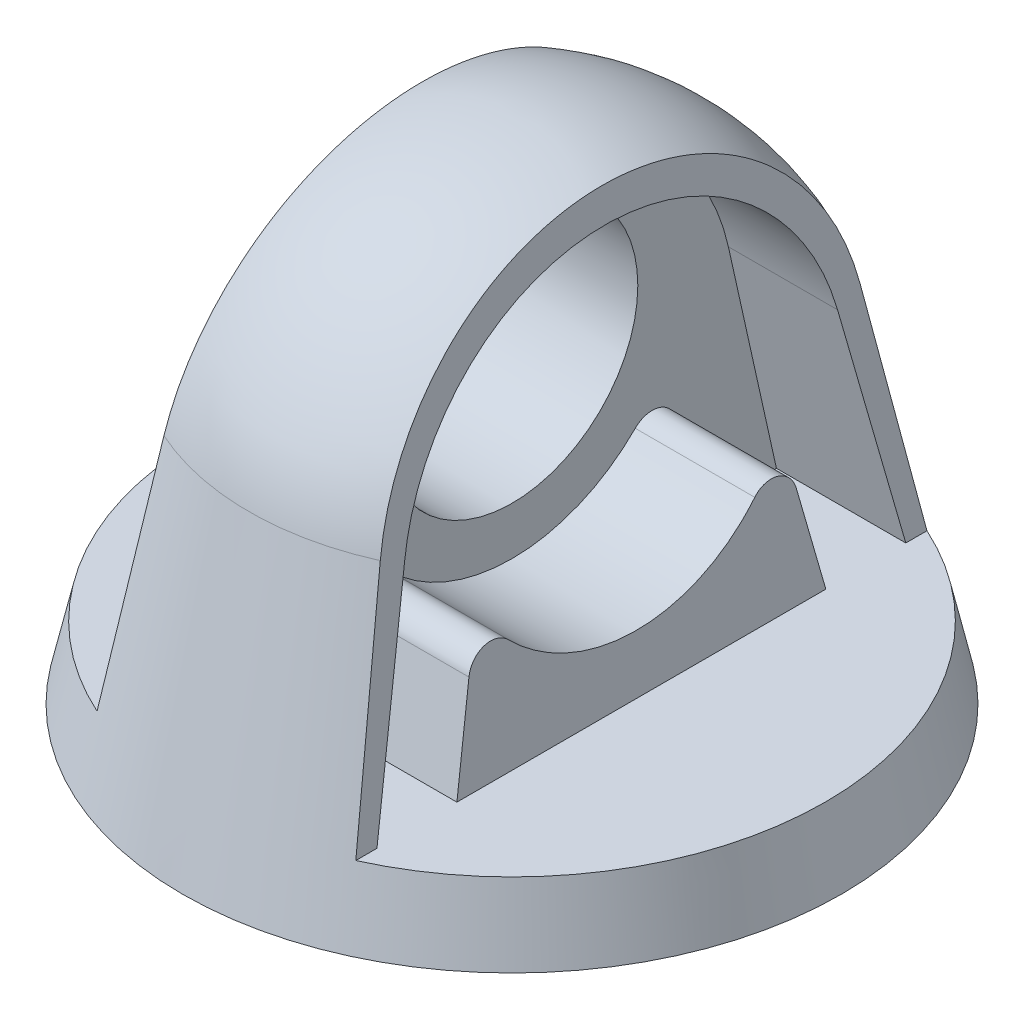
ISO-10303-21;
HEADER;
FILE_DESCRIPTION(('STEP AP214'),'2;1');
FILE_NAME('part.step','',(''),(''),'','','');
FILE_SCHEMA(('AUTOMOTIVE_DESIGN { 1 0 10303 214 1 1 1 1 }'));
ENDSEC;
DATA;
#1=APPLICATION_CONTEXT('core data for automotive mechanical design processes');
#2=APPLICATION_PROTOCOL_DEFINITION('international standard','automotive_design',2000,#1);
#3=PRODUCT_CONTEXT('',#1,'mechanical');
#4=PRODUCT('Part','Part','',(#3));
#5=PRODUCT_RELATED_PRODUCT_CATEGORY('part','',(#4));
#6=PRODUCT_DEFINITION_FORMATION('','',#4);
#7=PRODUCT_DEFINITION_CONTEXT('part definition',#1,'design');
#8=PRODUCT_DEFINITION('design','',#6,#7);
#9=PRODUCT_DEFINITION_SHAPE('','',#8);
#10=(LENGTH_UNIT() NAMED_UNIT(*) SI_UNIT(.MILLI.,.METRE.));
#11=(NAMED_UNIT(*) PLANE_ANGLE_UNIT() SI_UNIT($,.RADIAN.));
#12=(NAMED_UNIT(*) SI_UNIT($,.STERADIAN.) SOLID_ANGLE_UNIT());
#13=UNCERTAINTY_MEASURE_WITH_UNIT(LENGTH_MEASURE(1.E-05),#10,'distance_accuracy_value','');
#14=(GEOMETRIC_REPRESENTATION_CONTEXT(3) GLOBAL_UNCERTAINTY_ASSIGNED_CONTEXT((#13)) GLOBAL_UNIT_ASSIGNED_CONTEXT((#10,
#11,#12)) REPRESENTATION_CONTEXT('',''));
#15=CARTESIAN_POINT('',(0.,0.,0.));
#16=DIRECTION('',(0.,0.,1.));
#17=DIRECTION('',(1.,0.,0.));
#18=AXIS2_PLACEMENT_3D('',#15,#16,#17);
#19=CARTESIAN_POINT('',(21.5932881486711,12.,-276.496115993737));
#20=DIRECTION('',(0.995646288576863,0.0932119522546218,0.));
#21=DIRECTION('',(-0.0932119522546218,0.995646288576863,0.));
#22=AXIS2_PLACEMENT_3D('',#19,#20,#21);
#23=PLANE('',#22);
#24=CARTESIAN_POINT('',(18.971940896064,40.,0.));
#25=DIRECTION('',(0.995646288576863,0.0932119522546218,0.));
#26=DIRECTION('',(-0.0932119522546218,0.995646288576863,0.));
#27=AXIS2_PLACEMENT_3D('',#24,#25,#26);
#28=ELLIPSE('',#27,37.161791717103,37.);
#29=CARTESIAN_POINT('',(18.2196436442275,48.0356858598083,36.1168624434969));
#30=VERTEX_POINT('',#29);
#31=CARTESIAN_POINT('',(18.2196436442275,48.0356858598083,-36.1168624434969));
#32=VERTEX_POINT('',#31);
#33=EDGE_CURVE('E74',#30,#32,#28,.F.);
#34=ORIENTED_EDGE('',*,*,#33,.T.);
#35=DIRECTION('',(0.0910057646527772,-0.972080828949104,-0.216279478429154));
#36=VECTOR('',#35,1.);
#37=CARTESIAN_POINT('',(26.1667875724316,-36.8519724877858,-55.0036236322119));
#38=LINE('',#37,#36);
#39=CARTESIAN_POINT('',(21.5932881486711,12.,-44.134487223755));
#40=VERTEX_POINT('',#39);
#41=EDGE_CURVE('E12',#32,#40,#38,.T.);
#42=ORIENTED_EDGE('',*,*,#41,.T.);
#43=DIRECTION('',(0.,0.,1.));
#44=VECTOR('',#43,1.);
#45=CARTESIAN_POINT('',(21.5932881486711,12.,-276.496115993737));
#46=LINE('',#45,#44);
#47=CARTESIAN_POINT('',(21.5932881486711,12.,-47.6672822450918));
#48=VERTEX_POINT('',#47);
#49=EDGE_CURVE('E234',#48,#40,#46,.T.);
#50=ORIENTED_EDGE('',*,*,#49,.F.);
#51=CARTESIAN_POINT('',(18.0569660550566,49.7733314511182,-40.0428266893722));
#52=CARTESIAN_POINT('',(18.6463559614436,43.4777453312617,-41.3135882810776));
#53=CARTESIAN_POINT('',(19.2357459827641,37.18215798374,-42.5843437373356));
#54=CARTESIAN_POINT('',(20.414526255272,24.5909808333673,-45.1258423789565));
#55=CARTESIAN_POINT('',(21.0039165064593,18.2953910305162,-46.3965855643193));
#56=CARTESIAN_POINT('',(21.5933068725801,11.9998,-47.6673226142347));
#57=B_SPLINE_CURVE_WITH_KNOTS('',3,(#51,#52,#53,#54,#55,#56),.UNSPECIFIED.,.F.,.F.,(4,2,4),(0.,
19.3486325277537,38.6972650555043),.UNSPECIFIED.);
#58=CARTESIAN_POINT('',(18.0569847789655,49.7731314511182,-40.0428670593324));
#59=VERTEX_POINT('',#58);
#60=EDGE_CURVE('E257',#59,#48,#57,.T.);
#61=ORIENTED_EDGE('',*,*,#60,.F.);
#62=CARTESIAN_POINT('',(18.8071037938726,41.7607124949845,0.));
#63=DIRECTION('',(0.995646288576863,0.0932119522546218,0.));
#64=DIRECTION('',(-0.0932119522546218,0.995646288576863,0.));
#65=AXIS2_PLACEMENT_3D('',#62,#63,#64);
#66=CIRCLE('',#65,40.8435152551358);
#67=CARTESIAN_POINT('',(18.0569847789656,49.7731314511182,40.0428670593325));
#68=VERTEX_POINT('',#67);
#69=EDGE_CURVE('E237',#68,#59,#66,.F.);
#70=ORIENTED_EDGE('',*,*,#69,.F.);
#71=CARTESIAN_POINT('',(21.5933068725801,11.9998,47.6673226142347));
#72=CARTESIAN_POINT('',(21.0039165064593,18.2953910305162,46.3965855643193));
#73=CARTESIAN_POINT('',(20.414526255272,24.5909808333673,45.1258423789565));
#74=CARTESIAN_POINT('',(19.2357459827641,37.18215798374,42.5843437373356));
#75=CARTESIAN_POINT('',(18.6463559614436,43.4777453312617,41.3135882810776));
#76=CARTESIAN_POINT('',(18.0569660550566,49.7733314511182,40.0428266893722));
#77=B_SPLINE_CURVE_WITH_KNOTS('',3,(#71,#72,#73,#74,#75,#76),.UNSPECIFIED.,.F.,.F.,(4,2,4),(0.,
19.3486325277505,38.6972650555043),.UNSPECIFIED.);
#78=CARTESIAN_POINT('',(21.5932881486711,12.,47.6672822450918));
#79=VERTEX_POINT('',#78);
#80=EDGE_CURVE('E249',#79,#68,#77,.T.);
#81=ORIENTED_EDGE('',*,*,#80,.F.);
#82=CARTESIAN_POINT('',(21.5932881486711,12.,44.134487223755));
#83=VERTEX_POINT('',#82);
#84=EDGE_CURVE('E239',#83,#79,#46,.T.);
#85=ORIENTED_EDGE('',*,*,#84,.F.);
#86=DIRECTION('',(-0.0910057646527772,0.972080828949104,-0.216279478429154));
#87=VECTOR('',#86,1.);
#88=CARTESIAN_POINT('',(15.2824188075597,79.4097418323252,29.1364095224381));
#89=LINE('',#88,#87);
#90=EDGE_CURVE('E297',#83,#30,#89,.T.);
#91=ORIENTED_EDGE('',*,*,#90,.T.);
#92=EDGE_LOOP('',(#34,#42,#50,#61,#70,#81,#85,#91));
#93=FACE_BOUND('',#92,.T.);
#94=ADVANCED_FACE('F66',(#93),#23,.T.);
#95=CARTESIAN_POINT('',(-36.,50.,0.));
#96=DIRECTION('',(1.,0.,0.));
#97=DIRECTION('',(0.,0.,-1.));
#98=AXIS2_PLACEMENT_3D('',#95,#96,#97);
#99=CYLINDRICAL_SURFACE('',#98,21.);
#100=CARTESIAN_POINT('',(-18.0357454487043,50.,0.));
#101=DIRECTION('',(0.995646288576863,-0.0932119522546218,0.));
#102=DIRECTION('',(0.0932119522546218,0.995646288576863,0.));
#103=AXIS2_PLACEMENT_3D('',#100,#101,#102);
#104=ELLIPSE('',#103,21.0918277313287,21.);
#105=CARTESIAN_POINT('',(-16.069735009249,71.,0.));
#106=VERTEX_POINT('',#105);
#107=EDGE_CURVE('E192',#106,#106,#104,.F.);
#108=ORIENTED_EDGE('',*,*,#107,.T.);
#109=EDGE_LOOP('',(#108));
#110=FACE_BOUND('',#109,.T.);
#111=CARTESIAN_POINT('',(0.,50.,0.));
#112=DIRECTION('',(1.,0.,0.));
#113=DIRECTION('',(0.,0.,-1.));
#114=AXIS2_PLACEMENT_3D('',#111,#112,#113);
#115=CIRCLE('',#114,21.);
#116=CARTESIAN_POINT('',(0.,50.,-21.));
#117=VERTEX_POINT('',#116);
#118=EDGE_CURVE('E175',#117,#117,#115,.F.);
#119=ORIENTED_EDGE('',*,*,#118,.F.);
#120=EDGE_LOOP('',(#119));
#121=FACE_BOUND('',#120,.T.);
#122=ADVANCED_FACE('F287',(#110,#121),#99,.F.);
#123=CARTESIAN_POINT('',(0.,40.,0.));
#124=DIRECTION('',(0.,1.,0.));
#125=DIRECTION('',(1.,0.,0.));
#126=AXIS2_PLACEMENT_3D('',#123,#124,#125);
#127=SPHERICAL_SURFACE('',#126,45.);
#128=CARTESIAN_POINT('',(-18.8071037938726,41.7607124949845,0.));
#129=DIRECTION('',(0.995646288576863,-0.0932119522546218,0.));
#130=DIRECTION('',(0.0932119522546218,0.995646288576863,0.));
#131=AXIS2_PLACEMENT_3D('',#128,#129,#130);
#132=CIRCLE('',#131,40.8435152551358);
#133=CARTESIAN_POINT('',(-18.0569847789656,49.7731314511182,40.0428670593325));
#134=VERTEX_POINT('',#133);
#135=CARTESIAN_POINT('',(-18.0569847789656,49.7731314511182,-40.0428670593325));
#136=VERTEX_POINT('',#135);
#137=EDGE_CURVE('E335',#134,#136,#132,.F.);
#138=ORIENTED_EDGE('',*,*,#137,.F.);
#139=CARTESIAN_POINT('',(0.,49.7731314511182,0.));
#140=DIRECTION('',(0.,1.,0.));
#141=DIRECTION('',(0.,0.,1.));
#142=AXIS2_PLACEMENT_3D('',#139,#140,#141);
#143=CIRCLE('',#142,43.9259137826314);
#144=EDGE_CURVE('E244',#134,#68,#143,.T.);
#145=ORIENTED_EDGE('',*,*,#144,.T.);
#146=ORIENTED_EDGE('',*,*,#69,.T.);
#147=EDGE_CURVE('E246',#59,#136,#143,.T.);
#148=ORIENTED_EDGE('',*,*,#147,.T.);
#149=EDGE_LOOP('',(#138,#145,#146,#148));
#150=FACE_BOUND('',#149,.T.);
#151=ADVANCED_FACE('F68',(#150),#127,.T.);
#152=CARTESIAN_POINT('',(0.,49.7731314511182,0.));
#153=DIRECTION('',(0.,-1.,0.));
#154=DIRECTION('',(0.,0.,-1.));
#155=AXIS2_PLACEMENT_3D('',#152,#153,#154);
#156=CONICAL_SURFACE('',#155,43.9259137826314,0.218925298612067);
#157=CARTESIAN_POINT('',(-18.0569660550566,49.7733314511182,-40.0428266893722));
#158=CARTESIAN_POINT('',(-18.6463559614436,43.4777453312617,-41.3135882810776));
#159=CARTESIAN_POINT('',(-19.2357459827641,37.18215798374,-42.5843437373356));
#160=CARTESIAN_POINT('',(-20.414526255272,24.5909808333673,-45.1258423789565));
#161=CARTESIAN_POINT('',(-21.0039165064593,18.2953910305162,-46.3965855643193));
#162=CARTESIAN_POINT('',(-21.5933068725801,11.9998,-47.6673226142347));
#163=B_SPLINE_CURVE_WITH_KNOTS('',3,(#157,#158,#159,#160,#161,#162),.UNSPECIFIED.,.F.,.F.,(4,2,
4),(0.,19.3486325277537,38.6972650555043),.UNSPECIFIED.);
#164=CARTESIAN_POINT('',(-21.5932881486711,12.,-47.6672822450918));
#165=VERTEX_POINT('',#164);
#166=EDGE_CURVE('E195',#136,#165,#163,.T.);
#167=ORIENTED_EDGE('',*,*,#166,.F.);
#168=ORIENTED_EDGE('',*,*,#147,.F.);
#169=ORIENTED_EDGE('',*,*,#60,.T.);
#170=CARTESIAN_POINT('',(0.,12.,0.));
#171=DIRECTION('',(0.,1.,0.));
#172=DIRECTION('',(-1.,0.,0.));
#173=AXIS2_PLACEMENT_3D('',#170,#171,#172);
#174=CIRCLE('',#173,52.3301050037623);
#175=EDGE_CURVE('E247',#48,#79,#174,.F.);
#176=ORIENTED_EDGE('',*,*,#175,.T.);
#177=ORIENTED_EDGE('',*,*,#80,.T.);
#178=ORIENTED_EDGE('',*,*,#144,.F.);
#179=CARTESIAN_POINT('',(-21.5933068725801,11.9998,47.6673226142347));
#180=CARTESIAN_POINT('',(-21.0039165064593,18.2953910305162,46.3965855643193));
#181=CARTESIAN_POINT('',(-20.414526255272,24.5909808333673,45.1258423789565));
#182=CARTESIAN_POINT('',(-19.2357459827641,37.18215798374,42.5843437373356));
#183=CARTESIAN_POINT('',(-18.6463559614436,43.4777453312617,41.3135882810776));
#184=CARTESIAN_POINT('',(-18.0569660550566,49.7733314511182,40.0428266893722));
#185=B_SPLINE_CURVE_WITH_KNOTS('',3,(#179,#180,#181,#182,#183,#184),.UNSPECIFIED.,.F.,.F.,(4,2,
4),(0.,19.3486325277505,38.6972650555043),.UNSPECIFIED.);
#186=CARTESIAN_POINT('',(-21.5932881486711,12.,47.6672822450918));
#187=VERTEX_POINT('',#186);
#188=EDGE_CURVE('E328',#187,#134,#185,.T.);
#189=ORIENTED_EDGE('',*,*,#188,.F.);
#190=CARTESIAN_POINT('',(0.,12.,0.));
#191=DIRECTION('',(0.,1.,0.));
#192=DIRECTION('',(-1.,0.,0.));
#193=AXIS2_PLACEMENT_3D('',#190,#191,#192);
#194=CIRCLE('',#193,52.3301050037623);
#195=EDGE_CURVE('E81',#187,#165,#194,.F.);
#196=ORIENTED_EDGE('',*,*,#195,.T.);
#197=EDGE_LOOP('',(#167,#168,#169,#176,#177,#178,#189,#196));
#198=FACE_BOUND('',#197,.T.);
#199=CARTESIAN_POINT('',(0.,0.,0.));
#200=DIRECTION('',(0.,1.,0.));
#201=DIRECTION('',(0.,0.,1.));
#202=AXIS2_PLACEMENT_3D('',#199,#200,#201);
#203=CIRCLE('',#202,55.);
#204=CARTESIAN_POINT('',(0.,0.,55.));
#205=VERTEX_POINT('',#204);
#206=EDGE_CURVE('E241',#205,#205,#203,.T.);
#207=ORIENTED_EDGE('',*,*,#206,.T.);
#208=EDGE_LOOP('',(#207));
#209=FACE_BOUND('',#208,.T.);
#210=ADVANCED_FACE('F263',(#198,#209),#156,.T.);
#211=CARTESIAN_POINT('',(0.,0.,0.));
#212=DIRECTION('',(0.,-1.,0.));
#213=DIRECTION('',(0.,0.,-1.));
#214=AXIS2_PLACEMENT_3D('',#211,#212,#213);
#215=PLANE('',#214);
#216=ORIENTED_EDGE('',*,*,#206,.F.);
#217=EDGE_LOOP('',(#216));
#218=FACE_BOUND('',#217,.T.);
#219=ADVANCED_FACE('F277',(#218),#215,.T.);
#220=CARTESIAN_POINT('',(52.3301050037623,12.,-276.496115993737));
#221=DIRECTION('',(0.,1.,0.));
#222=DIRECTION('',(-1.,0.,0.));
#223=AXIS2_PLACEMENT_3D('',#220,#221,#222);
#224=PLANE('',#223);
#225=ORIENTED_EDGE('',*,*,#84,.T.);
#226=ORIENTED_EDGE('',*,*,#175,.F.);
#227=ORIENTED_EDGE('',*,*,#49,.T.);
#228=DIRECTION('',(-1.,0.,0.));
#229=VECTOR('',#228,1.);
#230=CARTESIAN_POINT('',(55.,12.,-44.134487223755));
#231=LINE('',#230,#229);
#232=CARTESIAN_POINT('',(0.,12.,-44.134487223755));
#233=VERTEX_POINT('',#232);
#234=EDGE_CURVE('E227',#40,#233,#231,.T.);
#235=ORIENTED_EDGE('',*,*,#234,.T.);
#236=DIRECTION('',(0.,0.,1.));
#237=VECTOR('',#236,1.);
#238=CARTESIAN_POINT('',(0.,12.,0.));
#239=LINE('',#238,#237);
#240=CARTESIAN_POINT('',(0.,12.,-30.7897926323778));
#241=VERTEX_POINT('',#240);
#242=EDGE_CURVE('E203',#233,#241,#239,.T.);
#243=ORIENTED_EDGE('',*,*,#242,.T.);
#244=DIRECTION('',(-1.,0.,0.));
#245=VECTOR('',#244,1.);
#246=CARTESIAN_POINT('',(55.,12.,-30.7897926323778));
#247=LINE('',#246,#245);
#248=CARTESIAN_POINT('',(21.5932881486711,12.,-30.7897926323778));
#249=VERTEX_POINT('',#248);
#250=EDGE_CURVE('E229',#249,#241,#247,.T.);
#251=ORIENTED_EDGE('',*,*,#250,.F.);
#252=CARTESIAN_POINT('',(21.5932881486711,12.,30.7897926323778));
#253=VERTEX_POINT('',#252);
#254=EDGE_CURVE('E238',#249,#253,#46,.T.);
#255=ORIENTED_EDGE('',*,*,#254,.T.);
#256=DIRECTION('',(-1.,0.,0.));
#257=VECTOR('',#256,1.);
#258=CARTESIAN_POINT('',(55.,12.,30.7897926323778));
#259=LINE('',#258,#257);
#260=CARTESIAN_POINT('',(0.,12.,30.7897926323778));
#261=VERTEX_POINT('',#260);
#262=EDGE_CURVE('E219',#253,#261,#259,.T.);
#263=ORIENTED_EDGE('',*,*,#262,.T.);
#264=CARTESIAN_POINT('',(0.,12.,44.134487223755));
#265=VERTEX_POINT('',#264);
#266=EDGE_CURVE('E207',#261,#265,#239,.T.);
#267=ORIENTED_EDGE('',*,*,#266,.T.);
#268=DIRECTION('',(-1.,0.,0.));
#269=VECTOR('',#268,1.);
#270=CARTESIAN_POINT('',(55.,12.,44.134487223755));
#271=LINE('',#270,#269);
#272=EDGE_CURVE('E221',#83,#265,#271,.T.);
#273=ORIENTED_EDGE('',*,*,#272,.F.);
#274=EDGE_LOOP('',(#225,#226,#227,#235,#243,#251,#255,#263,#267,#273));
#275=FACE_BOUND('',#274,.T.);
#276=ADVANCED_FACE('F272',(#275),#224,.T.);
#277=ORIENTED_EDGE('',*,*,#254,.F.);
#278=DIRECTION('',(-0.0910057646527772,0.972080828949104,0.216279478429154));
#279=VECTOR('',#278,1.);
#280=CARTESIAN_POINT('',(26.4294469166056,-39.6575762205829,-42.2831513214698));
#281=LINE('',#280,#279);
#282=CARTESIAN_POINT('',(20.1317254296663,27.6117264095524,-27.3163201137531));
#283=VERTEX_POINT('',#282);
#284=EDGE_CURVE('E301',#249,#283,#281,.T.);
#285=ORIENTED_EDGE('',*,*,#284,.T.);
#286=CARTESIAN_POINT('',(20.2130548622973,26.7430036138975,-23.4117944441859));
#287=DIRECTION('',(0.995646288576863,0.0932119522546218,0.));
#288=DIRECTION('',(-0.0932119522546218,0.995646288576863,0.));
#289=AXIS2_PLACEMENT_3D('',#286,#287,#288);
#290=ELLIPSE('',#289,4.01749099644357,4.);
#291=CARTESIAN_POINT('',(19.9491385697406,29.5620334788796,-20.574001178224));
#292=VERTEX_POINT('',#291);
#293=EDGE_CURVE('E306',#292,#283,#290,.F.);
#294=ORIENTED_EDGE('',*,*,#293,.F.);
#295=CARTESIAN_POINT('',(18.0357454487043,50.,0.));
#296=DIRECTION('',(0.995646288576863,0.0932119522546218,0.));
#297=DIRECTION('',(-0.0932119522546218,0.995646288576863,0.));
#298=AXIS2_PLACEMENT_3D('',#295,#296,#297);
#299=ELLIPSE('',#298,29.1268097242158,29.);
#300=CARTESIAN_POINT('',(19.9491385697406,29.5620334788796,20.574001178224));
#301=VERTEX_POINT('',#300);
#302=EDGE_CURVE('E308',#292,#301,#299,.F.);
#303=ORIENTED_EDGE('',*,*,#302,.T.);
#304=CARTESIAN_POINT('',(20.2130548622973,26.7430036138975,23.4117944441859));
#305=DIRECTION('',(0.995646288576863,0.0932119522546218,0.));
#306=DIRECTION('',(-0.0932119522546218,0.995646288576863,0.));
#307=AXIS2_PLACEMENT_3D('',#304,#305,#306);
#308=ELLIPSE('',#307,4.01749099644356,4.);
#309=CARTESIAN_POINT('',(20.1317254296663,27.6117264095524,27.3163201137531));
#310=VERTEX_POINT('',#309);
#311=EDGE_CURVE('E172',#310,#301,#308,.F.);
#312=ORIENTED_EDGE('',*,*,#311,.F.);
#313=DIRECTION('',(-0.0910057646527772,0.972080828949104,-0.216279478429153));
#314=VECTOR('',#313,1.);
#315=CARTESIAN_POINT('',(15.5450781517337,76.6041380995281,16.415937211696));
#316=LINE('',#315,#314);
#317=EDGE_CURVE('E310',#253,#310,#316,.T.);
#318=ORIENTED_EDGE('',*,*,#317,.F.);
#319=EDGE_LOOP('',(#277,#285,#294,#303,#312,#318));
#320=FACE_BOUND('',#319,.T.);
#321=ADVANCED_FACE('F266',(#320),#23,.T.);
#322=CARTESIAN_POINT('',(-52.3301050037623,12.,-276.496115993737));
#323=DIRECTION('',(0.,1.,0.));
#324=DIRECTION('',(-1.,0.,0.));
#325=AXIS2_PLACEMENT_3D('',#322,#323,#324);
#326=PLANE('',#325);
#327=ORIENTED_EDGE('',*,*,#195,.F.);
#328=DIRECTION('',(0.,0.,1.));
#329=VECTOR('',#328,1.);
#330=CARTESIAN_POINT('',(-21.5932881486711,12.,-266.734801819819));
#331=LINE('',#330,#329);
#332=EDGE_CURVE('E336',#165,#187,#331,.T.);
#333=ORIENTED_EDGE('',*,*,#332,.F.);
#334=EDGE_LOOP('',(#327,#333));
#335=FACE_BOUND('',#334,.T.);
#336=ADVANCED_FACE('F271',(#335),#326,.T.);
#337=CARTESIAN_POINT('',(0.,0.,0.));
#338=DIRECTION('',(1.,0.,0.));
#339=DIRECTION('',(0.,0.,-1.));
#340=AXIS2_PLACEMENT_3D('',#337,#338,#339);
#341=PLANE('',#340);
#342=CARTESIAN_POINT('',(0.,26.7430036138975,23.4117944441859));
#343=DIRECTION('',(1.,0.,0.));
#344=DIRECTION('',(0.,0.,-1.));
#345=AXIS2_PLACEMENT_3D('',#342,#343,#344);
#346=CIRCLE('',#345,4.);
#347=CARTESIAN_POINT('',(0.,29.5620334788796,20.574001178224));
#348=VERTEX_POINT('',#347);
#349=CARTESIAN_POINT('',(0.,27.6117264095524,27.3163201137531));
#350=VERTEX_POINT('',#349);
#351=EDGE_CURVE('E169',#348,#350,#346,.T.);
#352=ORIENTED_EDGE('',*,*,#351,.F.);
#353=CARTESIAN_POINT('',(0.,50.,0.));
#354=DIRECTION('',(1.,0.,0.));
#355=DIRECTION('',(0.,0.,-1.));
#356=AXIS2_PLACEMENT_3D('',#353,#354,#355);
#357=CIRCLE('',#356,29.);
#358=CARTESIAN_POINT('',(0.,29.5620334788796,-20.574001178224));
#359=VERTEX_POINT('',#358);
#360=EDGE_CURVE('E179',#348,#359,#357,.T.);
#361=ORIENTED_EDGE('',*,*,#360,.T.);
#362=CARTESIAN_POINT('',(0.,26.7430036138975,-23.4117944441859));
#363=DIRECTION('',(1.,0.,0.));
#364=DIRECTION('',(0.,0.,-1.));
#365=AXIS2_PLACEMENT_3D('',#362,#363,#364);
#366=CIRCLE('',#365,4.);
#367=CARTESIAN_POINT('',(0.,27.6117264095524,-27.3163201137531));
#368=VERTEX_POINT('',#367);
#369=EDGE_CURVE('E185',#368,#359,#366,.T.);
#370=ORIENTED_EDGE('',*,*,#369,.F.);
#371=DIRECTION('',(0.,-0.976131417391808,-0.217180698913737));
#372=VECTOR('',#371,1.);
#373=CARTESIAN_POINT('',(0.,7.09335016803246,-31.8814792852663));
#374=LINE('',#373,#372);
#375=EDGE_CURVE('E200',#368,#241,#374,.T.);
#376=ORIENTED_EDGE('',*,*,#375,.T.);
#377=ORIENTED_EDGE('',*,*,#242,.F.);
#378=DIRECTION('',(0.,0.976131417391809,0.217180698913737));
#379=VECTOR('',#378,1.);
#380=CARTESIAN_POINT('',(0.,9.92238409903462,-44.5967385819293));
#381=LINE('',#380,#379);
#382=CARTESIAN_POINT('',(0.,48.0356858598083,-36.1168624434969));
#383=VERTEX_POINT('',#382);
#384=EDGE_CURVE('E206',#233,#383,#381,.T.);
#385=ORIENTED_EDGE('',*,*,#384,.T.);
#386=CARTESIAN_POINT('',(0.,40.,0.));
#387=DIRECTION('',(1.,0.,0.));
#388=DIRECTION('',(0.,0.,-1.));
#389=AXIS2_PLACEMENT_3D('',#386,#387,#388);
#390=CIRCLE('',#389,37.);
#391=CARTESIAN_POINT('',(0.,48.0356858598083,36.1168624434969));
#392=VERTEX_POINT('',#391);
#393=EDGE_CURVE('E210',#383,#392,#390,.T.);
#394=ORIENTED_EDGE('',*,*,#393,.T.);
#395=DIRECTION('',(0.,-0.976131417391808,0.217180698913737));
#396=VECTOR('',#395,1.);
#397=CARTESIAN_POINT('',(0.,9.92238409903461,44.5967385819293));
#398=LINE('',#397,#396);
#399=EDGE_CURVE('E213',#392,#265,#398,.T.);
#400=ORIENTED_EDGE('',*,*,#399,.T.);
#401=ORIENTED_EDGE('',*,*,#266,.F.);
#402=DIRECTION('',(0.,-0.976131417391808,0.217180698913736));
#403=VECTOR('',#402,1.);
#404=CARTESIAN_POINT('',(0.,7.09335016803245,31.8814792852662));
#405=LINE('',#404,#403);
#406=EDGE_CURVE('E191',#350,#261,#405,.T.);
#407=ORIENTED_EDGE('',*,*,#406,.F.);
#408=EDGE_LOOP('',(#352,#361,#370,#376,#377,#385,#394,#400,#401,#407));
#409=FACE_BOUND('',#408,.T.);
#410=ORIENTED_EDGE('',*,*,#118,.T.);
#411=EDGE_LOOP('',(#410));
#412=FACE_BOUND('',#411,.T.);
#413=ADVANCED_FACE('F187',(#409,#412),#341,.T.);
#414=CARTESIAN_POINT('',(55.,50.,0.));
#415=DIRECTION('',(-1.,0.,0.));
#416=DIRECTION('',(0.,0.,1.));
#417=AXIS2_PLACEMENT_3D('',#414,#415,#416);
#418=CYLINDRICAL_SURFACE('',#417,29.);
#419=DIRECTION('',(-1.,0.,0.));
#420=VECTOR('',#419,1.);
#421=CARTESIAN_POINT('',(55.,29.5620334788796,-20.574001178224));
#422=LINE('',#421,#420);
#423=EDGE_CURVE('E176',#292,#359,#422,.T.);
#424=ORIENTED_EDGE('',*,*,#423,.T.);
#425=ORIENTED_EDGE('',*,*,#360,.F.);
#426=DIRECTION('',(-1.,0.,0.));
#427=VECTOR('',#426,1.);
#428=CARTESIAN_POINT('',(55.,29.5620334788796,20.574001178224));
#429=LINE('',#428,#427);
#430=EDGE_CURVE('E165',#301,#348,#429,.T.);
#431=ORIENTED_EDGE('',*,*,#430,.F.);
#432=ORIENTED_EDGE('',*,*,#302,.F.);
#433=EDGE_LOOP('',(#424,#425,#431,#432));
#434=FACE_BOUND('',#433,.T.);
#435=ADVANCED_FACE('F180',(#434),#418,.F.);
#436=CARTESIAN_POINT('',(55.,26.7430036138975,-23.4117944441859));
#437=DIRECTION('',(-1.,0.,0.));
#438=DIRECTION('',(0.,0.,1.));
#439=AXIS2_PLACEMENT_3D('',#436,#437,#438);
#440=CYLINDRICAL_SURFACE('',#439,4.);
#441=ORIENTED_EDGE('',*,*,#293,.T.);
#442=DIRECTION('',(-1.,0.,0.));
#443=VECTOR('',#442,1.);
#444=CARTESIAN_POINT('',(55.,27.6117264095524,-27.3163201137531));
#445=LINE('',#444,#443);
#446=EDGE_CURVE('E231',#283,#368,#445,.T.);
#447=ORIENTED_EDGE('',*,*,#446,.T.);
#448=ORIENTED_EDGE('',*,*,#369,.T.);
#449=ORIENTED_EDGE('',*,*,#423,.F.);
#450=EDGE_LOOP('',(#441,#447,#448,#449));
#451=FACE_BOUND('',#450,.T.);
#452=ADVANCED_FACE('F431',(#451),#440,.T.);
#453=CARTESIAN_POINT('',(55.,7.09335016803246,-31.8814792852663));
#454=DIRECTION('',(0.,0.217180698913737,-0.976131417391809));
#455=DIRECTION('',(0.,0.976131417391809,0.217180698913737));
#456=AXIS2_PLACEMENT_3D('',#453,#454,#455);
#457=PLANE('',#456);
#458=ORIENTED_EDGE('',*,*,#250,.T.);
#459=ORIENTED_EDGE('',*,*,#375,.F.);
#460=ORIENTED_EDGE('',*,*,#446,.F.);
#461=ORIENTED_EDGE('',*,*,#284,.F.);
#462=EDGE_LOOP('',(#458,#459,#460,#461));
#463=FACE_BOUND('',#462,.T.);
#464=ADVANCED_FACE('F423',(#463),#457,.T.);
#465=CARTESIAN_POINT('',(55.,9.92238409903462,-44.5967385819293));
#466=DIRECTION('',(0.,-0.217180698913737,0.976131417391809));
#467=DIRECTION('',(0.,-0.976131417391808,-0.217180698913737));
#468=AXIS2_PLACEMENT_3D('',#465,#466,#467);
#469=PLANE('',#468);
#470=DIRECTION('',(-1.,0.,0.));
#471=VECTOR('',#470,1.);
#472=CARTESIAN_POINT('',(55.,48.0356858598083,-36.1168624434969));
#473=LINE('',#472,#471);
#474=EDGE_CURVE('E225',#32,#383,#473,.T.);
#475=ORIENTED_EDGE('',*,*,#474,.T.);
#476=ORIENTED_EDGE('',*,*,#384,.F.);
#477=ORIENTED_EDGE('',*,*,#234,.F.);
#478=ORIENTED_EDGE('',*,*,#41,.F.);
#479=EDGE_LOOP('',(#475,#476,#477,#478));
#480=FACE_BOUND('',#479,.T.);
#481=ADVANCED_FACE('F416',(#480),#469,.T.);
#482=CARTESIAN_POINT('',(55.,40.,0.));
#483=DIRECTION('',(-1.,0.,0.));
#484=DIRECTION('',(0.,0.,1.));
#485=AXIS2_PLACEMENT_3D('',#482,#483,#484);
#486=CYLINDRICAL_SURFACE('',#485,37.);
#487=DIRECTION('',(-1.,0.,0.));
#488=VECTOR('',#487,1.);
#489=CARTESIAN_POINT('',(55.,48.0356858598083,36.1168624434969));
#490=LINE('',#489,#488);
#491=EDGE_CURVE('E223',#30,#392,#490,.T.);
#492=ORIENTED_EDGE('',*,*,#491,.T.);
#493=ORIENTED_EDGE('',*,*,#393,.F.);
#494=ORIENTED_EDGE('',*,*,#474,.F.);
#495=ORIENTED_EDGE('',*,*,#33,.F.);
#496=EDGE_LOOP('',(#492,#493,#494,#495));
#497=FACE_BOUND('',#496,.T.);
#498=ADVANCED_FACE('F408',(#497),#486,.F.);
#499=CARTESIAN_POINT('',(55.,9.92238409903461,44.5967385819293));
#500=DIRECTION('',(0.,-0.217180698913737,-0.976131417391809));
#501=DIRECTION('',(0.,0.976131417391809,-0.217180698913737));
#502=AXIS2_PLACEMENT_3D('',#499,#500,#501);
#503=PLANE('',#502);
#504=ORIENTED_EDGE('',*,*,#272,.T.);
#505=ORIENTED_EDGE('',*,*,#399,.F.);
#506=ORIENTED_EDGE('',*,*,#491,.F.);
#507=ORIENTED_EDGE('',*,*,#90,.F.);
#508=EDGE_LOOP('',(#504,#505,#506,#507));
#509=FACE_BOUND('',#508,.T.);
#510=ADVANCED_FACE('F401',(#509),#503,.T.);
#511=CARTESIAN_POINT('',(55.,7.09335016803245,31.8814792852662));
#512=DIRECTION('',(0.,-0.217180698913736,-0.976131417391809));
#513=DIRECTION('',(0.,0.976131417391809,-0.217180698913736));
#514=AXIS2_PLACEMENT_3D('',#511,#512,#513);
#515=PLANE('',#514);
#516=ORIENTED_EDGE('',*,*,#317,.T.);
#517=DIRECTION('',(-1.,0.,0.));
#518=VECTOR('',#517,1.);
#519=CARTESIAN_POINT('',(55.,27.6117264095524,27.3163201137531));
#520=LINE('',#519,#518);
#521=EDGE_CURVE('E217',#310,#350,#520,.T.);
#522=ORIENTED_EDGE('',*,*,#521,.T.);
#523=ORIENTED_EDGE('',*,*,#406,.T.);
#524=ORIENTED_EDGE('',*,*,#262,.F.);
#525=EDGE_LOOP('',(#516,#522,#523,#524));
#526=FACE_BOUND('',#525,.T.);
#527=ADVANCED_FACE('F395',(#526),#515,.F.);
#528=CARTESIAN_POINT('',(55.,26.7430036138975,23.4117944441859));
#529=DIRECTION('',(-1.,0.,0.));
#530=DIRECTION('',(0.,0.,1.));
#531=AXIS2_PLACEMENT_3D('',#528,#529,#530);
#532=CYLINDRICAL_SURFACE('',#531,4.);
#533=ORIENTED_EDGE('',*,*,#311,.T.);
#534=ORIENTED_EDGE('',*,*,#430,.T.);
#535=ORIENTED_EDGE('',*,*,#351,.T.);
#536=ORIENTED_EDGE('',*,*,#521,.F.);
#537=EDGE_LOOP('',(#533,#534,#535,#536));
#538=FACE_BOUND('',#537,.T.);
#539=ADVANCED_FACE('F167',(#538),#532,.T.);
#540=CARTESIAN_POINT('',(-21.5932881486711,12.,-266.734801819819));
#541=DIRECTION('',(0.995646288576863,-0.0932119522546218,0.));
#542=DIRECTION('',(0.0932119522546218,0.995646288576863,0.));
#543=AXIS2_PLACEMENT_3D('',#540,#541,#542);
#544=PLANE('',#543);
#545=ORIENTED_EDGE('',*,*,#137,.T.);
#546=ORIENTED_EDGE('',*,*,#166,.T.);
#547=ORIENTED_EDGE('',*,*,#332,.T.);
#548=ORIENTED_EDGE('',*,*,#188,.T.);
#549=EDGE_LOOP('',(#545,#546,#547,#548));
#550=FACE_BOUND('',#549,.T.);
#551=ORIENTED_EDGE('',*,*,#107,.F.);
#552=EDGE_LOOP('',(#551));
#553=FACE_BOUND('',#552,.T.);
#554=ADVANCED_FACE('F333',(#550,#553),#544,.F.);
#555=CLOSED_SHELL('',(#94,#122,#151,#210,#219,#276,#321,#336,#413,#435,#452,#464,#481,#498,#510,
#527,#539,#554));
#556=MANIFOLD_SOLID_BREP('B2',#555);
#557=ADVANCED_BREP_SHAPE_REPRESENTATION('',(#18,#556),#14);
#558=SHAPE_DEFINITION_REPRESENTATION(#9,#557);
ENDSEC;
END-ISO-10303-21;
